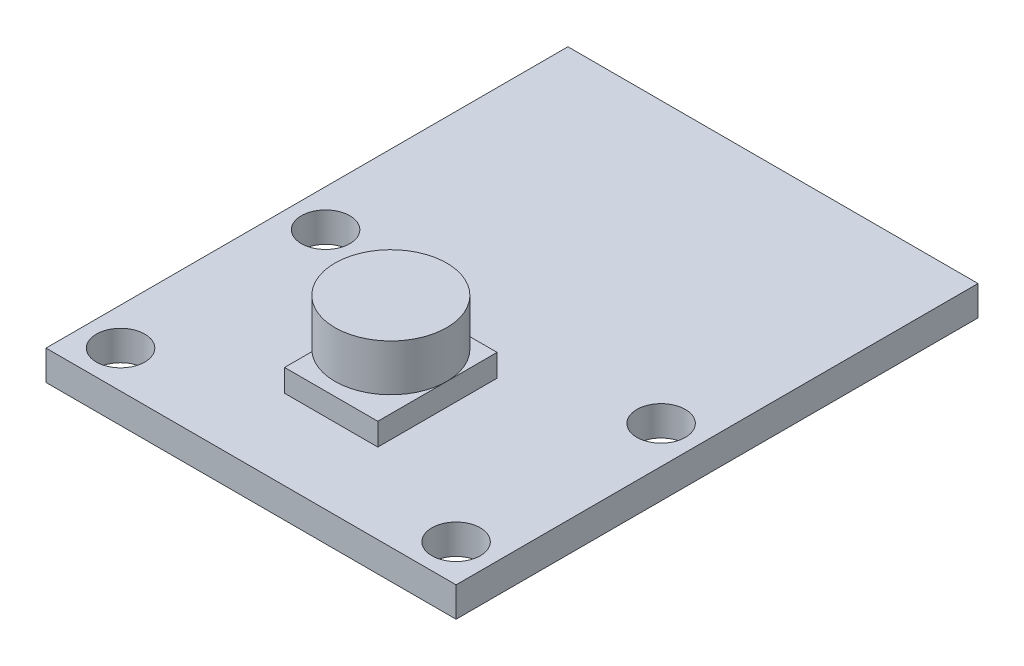
ISO-10303-21;
HEADER;
FILE_DESCRIPTION(('STEP AP214'),'2;1');
FILE_NAME('part.step','',(''),(''),'','','');
FILE_SCHEMA(('AUTOMOTIVE_DESIGN { 1 0 10303 214 1 1 1 1 }'));
ENDSEC;
DATA;
#1=APPLICATION_CONTEXT('core data for automotive mechanical design processes');
#2=APPLICATION_PROTOCOL_DEFINITION('international standard','automotive_design',2000,#1);
#3=PRODUCT_CONTEXT('',#1,'mechanical');
#4=PRODUCT('Part','Part','',(#3));
#5=PRODUCT_RELATED_PRODUCT_CATEGORY('part','',(#4));
#6=PRODUCT_DEFINITION_FORMATION('','',#4);
#7=PRODUCT_DEFINITION_CONTEXT('part definition',#1,'design');
#8=PRODUCT_DEFINITION('design','',#6,#7);
#9=PRODUCT_DEFINITION_SHAPE('','',#8);
#10=(LENGTH_UNIT() NAMED_UNIT(*) SI_UNIT(.MILLI.,.METRE.));
#11=(NAMED_UNIT(*) PLANE_ANGLE_UNIT() SI_UNIT($,.RADIAN.));
#12=(NAMED_UNIT(*) SI_UNIT($,.STERADIAN.) SOLID_ANGLE_UNIT());
#13=UNCERTAINTY_MEASURE_WITH_UNIT(LENGTH_MEASURE(1.E-05),#10,'distance_accuracy_value','');
#14=(GEOMETRIC_REPRESENTATION_CONTEXT(3) GLOBAL_UNCERTAINTY_ASSIGNED_CONTEXT((#13)) GLOBAL_UNIT_ASSIGNED_CONTEXT((#10,
#11,#12)) REPRESENTATION_CONTEXT('',''));
#15=CARTESIAN_POINT('',(0.,0.,0.));
#16=DIRECTION('',(0.,0.,1.));
#17=DIRECTION('',(1.,0.,0.));
#18=AXIS2_PLACEMENT_3D('',#15,#16,#17);
#19=CARTESIAN_POINT('',(0.,5.8,0.));
#20=DIRECTION('',(0.,-1.,0.));
#21=DIRECTION('',(0.,0.,-1.));
#22=AXIS2_PLACEMENT_3D('',#19,#20,#21);
#23=CYLINDRICAL_SURFACE('',#22,3.);
#24=CARTESIAN_POINT('',(0.,5.8,0.));
#25=DIRECTION('',(0.,1.,0.));
#26=DIRECTION('',(0.,0.,1.));
#27=AXIS2_PLACEMENT_3D('',#24,#25,#26);
#28=CIRCLE('',#27,3.);
#29=CARTESIAN_POINT('',(0.,5.8,3.));
#30=VERTEX_POINT('',#29);
#31=EDGE_CURVE('E11',#30,#30,#28,.T.);
#32=ORIENTED_EDGE('',*,*,#31,.F.);
#33=EDGE_LOOP('',(#32));
#34=FACE_BOUND('',#33,.T.);
#35=CARTESIAN_POINT('',(0.,3.3,0.));
#36=DIRECTION('',(0.,1.,0.));
#37=DIRECTION('',(0.,0.,1.));
#38=AXIS2_PLACEMENT_3D('',#35,#36,#37);
#39=CIRCLE('',#38,3.);
#40=CARTESIAN_POINT('',(0.,3.3,3.));
#41=VERTEX_POINT('',#40);
#42=EDGE_CURVE('E44',#41,#41,#39,.T.);
#43=ORIENTED_EDGE('',*,*,#42,.T.);
#44=EDGE_LOOP('',(#43));
#45=FACE_BOUND('',#44,.T.);
#46=ADVANCED_FACE('F41',(#34,#45),#23,.T.);
#47=CARTESIAN_POINT('',(0.,5.8,0.));
#48=DIRECTION('',(0.,1.,0.));
#49=DIRECTION('',(0.,0.,1.));
#50=AXIS2_PLACEMENT_3D('',#47,#48,#49);
#51=PLANE('',#50);
#52=ORIENTED_EDGE('',*,*,#31,.T.);
#53=EDGE_LOOP('',(#52));
#54=FACE_BOUND('',#53,.T.);
#55=ADVANCED_FACE('F56',(#54),#51,.T.);
#56=CARTESIAN_POINT('',(0.,3.3,0.));
#57=DIRECTION('',(0.,1.,0.));
#58=DIRECTION('',(0.,0.,1.));
#59=AXIS2_PLACEMENT_3D('',#56,#57,#58);
#60=PLANE('',#59);
#61=ORIENTED_EDGE('',*,*,#42,.F.);
#62=EDGE_LOOP('',(#61));
#63=FACE_BOUND('',#62,.T.);
#64=ADVANCED_FACE('F54',(#63),#60,.F.);
#65=CLOSED_SHELL('',(#46,#55,#64));
#66=MANIFOLD_SOLID_BREP('B2',#65);
#67=CARTESIAN_POINT('',(0.,1.6,0.));
#68=DIRECTION('',(0.,1.,0.));
#69=DIRECTION('',(0.,0.,1.));
#70=AXIS2_PLACEMENT_3D('',#67,#68,#69);
#71=PLANE('',#70);
#72=CARTESIAN_POINT('',(9.,1.6,5.5));
#73=DIRECTION('',(0.,1.,0.));
#74=DIRECTION('',(0.,0.,1.));
#75=AXIS2_PLACEMENT_3D('',#72,#73,#74);
#76=CIRCLE('',#75,1.3);
#77=CARTESIAN_POINT('',(9.,1.6,6.8));
#78=VERTEX_POINT('',#77);
#79=EDGE_CURVE('E191',#78,#78,#76,.T.);
#80=ORIENTED_EDGE('',*,*,#79,.F.);
#81=EDGE_LOOP('',(#80));
#82=FACE_BOUND('',#81,.T.);
#83=CARTESIAN_POINT('',(-9.,1.6,-5.5));
#84=DIRECTION('',(0.,1.,0.));
#85=DIRECTION('',(0.,0.,1.));
#86=AXIS2_PLACEMENT_3D('',#83,#84,#85);
#87=CIRCLE('',#86,1.3);
#88=CARTESIAN_POINT('',(-9.,1.6,-4.2));
#89=VERTEX_POINT('',#88);
#90=EDGE_CURVE('E203',#89,#89,#87,.T.);
#91=ORIENTED_EDGE('',*,*,#90,.F.);
#92=EDGE_LOOP('',(#91));
#93=FACE_BOUND('',#92,.T.);
#94=DIRECTION('',(0.,0.,1.));
#95=VECTOR('',#94,1.);
#96=CARTESIAN_POINT('',(-11.,1.6,-20.5));
#97=LINE('',#96,#95);
#98=CARTESIAN_POINT('',(-11.,1.6,-20.5));
#99=VERTEX_POINT('',#98);
#100=CARTESIAN_POINT('',(-11.,1.6,7.5));
#101=VERTEX_POINT('',#100);
#102=EDGE_CURVE('E209',#99,#101,#97,.T.);
#103=ORIENTED_EDGE('',*,*,#102,.T.);
#104=DIRECTION('',(1.,0.,0.));
#105=VECTOR('',#104,1.);
#106=CARTESIAN_POINT('',(-11.,1.6,7.5));
#107=LINE('',#106,#105);
#108=CARTESIAN_POINT('',(11.,1.6,7.5));
#109=VERTEX_POINT('',#108);
#110=EDGE_CURVE('E133',#101,#109,#107,.T.);
#111=ORIENTED_EDGE('',*,*,#110,.T.);
#112=DIRECTION('',(0.,0.,-1.));
#113=VECTOR('',#112,1.);
#114=CARTESIAN_POINT('',(11.,1.6,-20.5));
#115=LINE('',#114,#113);
#116=CARTESIAN_POINT('',(11.,1.6,-20.5));
#117=VERTEX_POINT('',#116);
#118=EDGE_CURVE('E212',#109,#117,#115,.T.);
#119=ORIENTED_EDGE('',*,*,#118,.T.);
#120=DIRECTION('',(-1.,0.,0.));
#121=VECTOR('',#120,1.);
#122=CARTESIAN_POINT('',(-11.,1.6,-20.5));
#123=LINE('',#122,#121);
#124=EDGE_CURVE('E105',#117,#99,#123,.T.);
#125=ORIENTED_EDGE('',*,*,#124,.T.);
#126=EDGE_LOOP('',(#103,#111,#119,#125));
#127=FACE_BOUND('',#126,.T.);
#128=CARTESIAN_POINT('',(9.,1.6,-5.5));
#129=DIRECTION('',(0.,1.,0.));
#130=DIRECTION('',(0.,0.,1.));
#131=AXIS2_PLACEMENT_3D('',#128,#129,#130);
#132=CIRCLE('',#131,1.3);
#133=CARTESIAN_POINT('',(9.,1.6,-4.2));
#134=VERTEX_POINT('',#133);
#135=EDGE_CURVE('E197',#134,#134,#132,.T.);
#136=ORIENTED_EDGE('',*,*,#135,.F.);
#137=EDGE_LOOP('',(#136));
#138=FACE_BOUND('',#137,.T.);
#139=CARTESIAN_POINT('',(-9.,1.6,5.5));
#140=DIRECTION('',(0.,1.,0.));
#141=DIRECTION('',(0.,0.,1.));
#142=AXIS2_PLACEMENT_3D('',#139,#140,#141);
#143=CIRCLE('',#142,1.3);
#144=CARTESIAN_POINT('',(-9.,1.6,6.8));
#145=VERTEX_POINT('',#144);
#146=EDGE_CURVE('E183',#145,#145,#143,.T.);
#147=ORIENTED_EDGE('',*,*,#146,.F.);
#148=EDGE_LOOP('',(#147));
#149=FACE_BOUND('',#148,.T.);
#150=DIRECTION('',(1.,0.,0.));
#151=VECTOR('',#150,1.);
#152=CARTESIAN_POINT('',(-2.5,1.6,3.2));
#153=LINE('',#152,#151);
#154=CARTESIAN_POINT('',(-2.5,1.6,3.2));
#155=VERTEX_POINT('',#154);
#156=CARTESIAN_POINT('',(2.5,1.6,3.2));
#157=VERTEX_POINT('',#156);
#158=EDGE_CURVE('E379',#155,#157,#153,.T.);
#159=ORIENTED_EDGE('',*,*,#158,.F.);
#160=DIRECTION('',(0.,0.,1.));
#161=VECTOR('',#160,1.);
#162=CARTESIAN_POINT('',(-2.5,1.6,-3.2));
#163=LINE('',#162,#161);
#164=CARTESIAN_POINT('',(-2.5,1.6,-3.2));
#165=VERTEX_POINT('',#164);
#166=EDGE_CURVE('E178',#165,#155,#163,.T.);
#167=ORIENTED_EDGE('',*,*,#166,.F.);
#168=DIRECTION('',(-1.,0.,0.));
#169=VECTOR('',#168,1.);
#170=CARTESIAN_POINT('',(-2.5,1.6,-3.2));
#171=LINE('',#170,#169);
#172=CARTESIAN_POINT('',(2.5,1.6,-3.2));
#173=VERTEX_POINT('',#172);
#174=EDGE_CURVE('E174',#173,#165,#171,.T.);
#175=ORIENTED_EDGE('',*,*,#174,.F.);
#176=DIRECTION('',(0.,0.,-1.));
#177=VECTOR('',#176,1.);
#178=CARTESIAN_POINT('',(2.5,1.6,-3.2));
#179=LINE('',#178,#177);
#180=EDGE_CURVE('E376',#157,#173,#179,.T.);
#181=ORIENTED_EDGE('',*,*,#180,.F.);
#182=EDGE_LOOP('',(#159,#167,#175,#181));
#183=FACE_BOUND('',#182,.T.);
#184=ADVANCED_FACE('F81',(#82,#93,#127,#138,#149,#183),#71,.T.);
#185=CARTESIAN_POINT('',(0.,0.,0.));
#186=DIRECTION('',(0.,1.,0.));
#187=DIRECTION('',(0.,0.,1.));
#188=AXIS2_PLACEMENT_3D('',#185,#186,#187);
#189=PLANE('',#188);
#190=DIRECTION('',(0.,0.,1.));
#191=VECTOR('',#190,1.);
#192=CARTESIAN_POINT('',(-11.,0.,-20.5));
#193=LINE('',#192,#191);
#194=CARTESIAN_POINT('',(-11.,0.,-20.5));
#195=VERTEX_POINT('',#194);
#196=CARTESIAN_POINT('',(-11.,0.,7.5));
#197=VERTEX_POINT('',#196);
#198=EDGE_CURVE('E206',#195,#197,#193,.T.);
#199=ORIENTED_EDGE('',*,*,#198,.F.);
#200=DIRECTION('',(-1.,0.,0.));
#201=VECTOR('',#200,1.);
#202=CARTESIAN_POINT('',(-11.,0.,-20.5));
#203=LINE('',#202,#201);
#204=CARTESIAN_POINT('',(11.,0.,-20.5));
#205=VERTEX_POINT('',#204);
#206=EDGE_CURVE('E126',#205,#195,#203,.T.);
#207=ORIENTED_EDGE('',*,*,#206,.F.);
#208=DIRECTION('',(0.,0.,-1.));
#209=VECTOR('',#208,1.);
#210=CARTESIAN_POINT('',(11.,0.,-20.5));
#211=LINE('',#210,#209);
#212=CARTESIAN_POINT('',(11.,0.,7.5));
#213=VERTEX_POINT('',#212);
#214=EDGE_CURVE('E220',#213,#205,#211,.T.);
#215=ORIENTED_EDGE('',*,*,#214,.F.);
#216=DIRECTION('',(1.,0.,0.));
#217=VECTOR('',#216,1.);
#218=CARTESIAN_POINT('',(-11.,0.,7.5));
#219=LINE('',#218,#217);
#220=EDGE_CURVE('E218',#197,#213,#219,.T.);
#221=ORIENTED_EDGE('',*,*,#220,.F.);
#222=EDGE_LOOP('',(#199,#207,#215,#221));
#223=FACE_BOUND('',#222,.T.);
#224=CARTESIAN_POINT('',(-9.,0.,-5.5));
#225=DIRECTION('',(0.,1.,0.));
#226=DIRECTION('',(0.,0.,1.));
#227=AXIS2_PLACEMENT_3D('',#224,#225,#226);
#228=CIRCLE('',#227,1.3);
#229=CARTESIAN_POINT('',(-9.,0.,-4.2));
#230=VERTEX_POINT('',#229);
#231=EDGE_CURVE('E200',#230,#230,#228,.T.);
#232=ORIENTED_EDGE('',*,*,#231,.T.);
#233=EDGE_LOOP('',(#232));
#234=FACE_BOUND('',#233,.T.);
#235=CARTESIAN_POINT('',(9.,0.,-5.5));
#236=DIRECTION('',(0.,1.,0.));
#237=DIRECTION('',(0.,0.,1.));
#238=AXIS2_PLACEMENT_3D('',#235,#236,#237);
#239=CIRCLE('',#238,1.3);
#240=CARTESIAN_POINT('',(9.,0.,-4.2));
#241=VERTEX_POINT('',#240);
#242=EDGE_CURVE('E194',#241,#241,#239,.T.);
#243=ORIENTED_EDGE('',*,*,#242,.T.);
#244=EDGE_LOOP('',(#243));
#245=FACE_BOUND('',#244,.T.);
#246=CARTESIAN_POINT('',(9.,0.,5.5));
#247=DIRECTION('',(0.,1.,0.));
#248=DIRECTION('',(0.,0.,1.));
#249=AXIS2_PLACEMENT_3D('',#246,#247,#248);
#250=CIRCLE('',#249,1.3);
#251=CARTESIAN_POINT('',(9.,0.,6.8));
#252=VERTEX_POINT('',#251);
#253=EDGE_CURVE('E189',#252,#252,#250,.T.);
#254=ORIENTED_EDGE('',*,*,#253,.T.);
#255=EDGE_LOOP('',(#254));
#256=FACE_BOUND('',#255,.T.);
#257=CARTESIAN_POINT('',(-9.,0.,5.5));
#258=DIRECTION('',(0.,1.,0.));
#259=DIRECTION('',(0.,0.,1.));
#260=AXIS2_PLACEMENT_3D('',#257,#258,#259);
#261=CIRCLE('',#260,1.3);
#262=CARTESIAN_POINT('',(-9.,0.,6.8));
#263=VERTEX_POINT('',#262);
#264=EDGE_CURVE('E180',#263,#263,#261,.T.);
#265=ORIENTED_EDGE('',*,*,#264,.T.);
#266=EDGE_LOOP('',(#265));
#267=FACE_BOUND('',#266,.T.);
#268=ADVANCED_FACE('F233',(#223,#234,#245,#256,#267),#189,.F.);
#269=CARTESIAN_POINT('',(-11.,1.6,-20.5));
#270=DIRECTION('',(1.,0.,0.));
#271=DIRECTION('',(0.,0.,-1.));
#272=AXIS2_PLACEMENT_3D('',#269,#270,#271);
#273=PLANE('',#272);
#274=ORIENTED_EDGE('',*,*,#198,.T.);
#275=DIRECTION('',(0.,-1.,0.));
#276=VECTOR('',#275,1.);
#277=CARTESIAN_POINT('',(-11.,1.6,7.5));
#278=LINE('',#277,#276);
#279=EDGE_CURVE('E39',#101,#197,#278,.T.);
#280=ORIENTED_EDGE('',*,*,#279,.F.);
#281=ORIENTED_EDGE('',*,*,#102,.F.);
#282=DIRECTION('',(0.,-1.,0.));
#283=VECTOR('',#282,1.);
#284=CARTESIAN_POINT('',(-11.,1.6,-20.5));
#285=LINE('',#284,#283);
#286=EDGE_CURVE('E215',#99,#195,#285,.T.);
#287=ORIENTED_EDGE('',*,*,#286,.T.);
#288=EDGE_LOOP('',(#274,#280,#281,#287));
#289=FACE_BOUND('',#288,.T.);
#290=ADVANCED_FACE('F83',(#289),#273,.F.);
#291=CARTESIAN_POINT('',(-11.,1.6,7.5));
#292=DIRECTION('',(0.,0.,-1.));
#293=DIRECTION('',(-1.,0.,0.));
#294=AXIS2_PLACEMENT_3D('',#291,#292,#293);
#295=PLANE('',#294);
#296=ORIENTED_EDGE('',*,*,#220,.T.);
#297=DIRECTION('',(0.,-1.,0.));
#298=VECTOR('',#297,1.);
#299=CARTESIAN_POINT('',(11.,1.6,7.5));
#300=LINE('',#299,#298);
#301=EDGE_CURVE('E89',#109,#213,#300,.T.);
#302=ORIENTED_EDGE('',*,*,#301,.F.);
#303=ORIENTED_EDGE('',*,*,#110,.F.);
#304=ORIENTED_EDGE('',*,*,#279,.T.);
#305=EDGE_LOOP('',(#296,#302,#303,#304));
#306=FACE_BOUND('',#305,.T.);
#307=ADVANCED_FACE('F249',(#306),#295,.F.);
#308=CARTESIAN_POINT('',(11.,1.6,-20.5));
#309=DIRECTION('',(-1.,0.,0.));
#310=DIRECTION('',(0.,0.,1.));
#311=AXIS2_PLACEMENT_3D('',#308,#309,#310);
#312=PLANE('',#311);
#313=ORIENTED_EDGE('',*,*,#214,.T.);
#314=DIRECTION('',(0.,-1.,0.));
#315=VECTOR('',#314,1.);
#316=CARTESIAN_POINT('',(11.,1.6,-20.5));
#317=LINE('',#316,#315);
#318=EDGE_CURVE('E224',#117,#205,#317,.T.);
#319=ORIENTED_EDGE('',*,*,#318,.F.);
#320=ORIENTED_EDGE('',*,*,#118,.F.);
#321=ORIENTED_EDGE('',*,*,#301,.T.);
#322=EDGE_LOOP('',(#313,#319,#320,#321));
#323=FACE_BOUND('',#322,.T.);
#324=ADVANCED_FACE('F229',(#323),#312,.F.);
#325=CARTESIAN_POINT('',(-11.,1.6,-20.5));
#326=DIRECTION('',(0.,0.,1.));
#327=DIRECTION('',(1.,0.,0.));
#328=AXIS2_PLACEMENT_3D('',#325,#326,#327);
#329=PLANE('',#328);
#330=ORIENTED_EDGE('',*,*,#206,.T.);
#331=ORIENTED_EDGE('',*,*,#286,.F.);
#332=ORIENTED_EDGE('',*,*,#124,.F.);
#333=ORIENTED_EDGE('',*,*,#318,.T.);
#334=EDGE_LOOP('',(#330,#331,#332,#333));
#335=FACE_BOUND('',#334,.T.);
#336=ADVANCED_FACE('F238',(#335),#329,.F.);
#337=CARTESIAN_POINT('',(-9.,1.6,-5.5));
#338=DIRECTION('',(0.,-1.,0.));
#339=DIRECTION('',(0.,0.,-1.));
#340=AXIS2_PLACEMENT_3D('',#337,#338,#339);
#341=CYLINDRICAL_SURFACE('',#340,1.3);
#342=ORIENTED_EDGE('',*,*,#90,.T.);
#343=EDGE_LOOP('',(#342));
#344=FACE_BOUND('',#343,.T.);
#345=ORIENTED_EDGE('',*,*,#231,.F.);
#346=EDGE_LOOP('',(#345));
#347=FACE_BOUND('',#346,.T.);
#348=ADVANCED_FACE('F240',(#344,#347),#341,.F.);
#349=CARTESIAN_POINT('',(9.,1.6,-5.5));
#350=DIRECTION('',(0.,-1.,0.));
#351=DIRECTION('',(0.,0.,-1.));
#352=AXIS2_PLACEMENT_3D('',#349,#350,#351);
#353=CYLINDRICAL_SURFACE('',#352,1.3);
#354=ORIENTED_EDGE('',*,*,#135,.T.);
#355=EDGE_LOOP('',(#354));
#356=FACE_BOUND('',#355,.T.);
#357=ORIENTED_EDGE('',*,*,#242,.F.);
#358=EDGE_LOOP('',(#357));
#359=FACE_BOUND('',#358,.T.);
#360=ADVANCED_FACE('F246',(#356,#359),#353,.F.);
#361=CARTESIAN_POINT('',(9.,1.6,5.5));
#362=DIRECTION('',(0.,-1.,0.));
#363=DIRECTION('',(0.,0.,-1.));
#364=AXIS2_PLACEMENT_3D('',#361,#362,#363);
#365=CYLINDRICAL_SURFACE('',#364,1.3);
#366=ORIENTED_EDGE('',*,*,#79,.T.);
#367=EDGE_LOOP('',(#366));
#368=FACE_BOUND('',#367,.T.);
#369=ORIENTED_EDGE('',*,*,#253,.F.);
#370=EDGE_LOOP('',(#369));
#371=FACE_BOUND('',#370,.T.);
#372=ADVANCED_FACE('F263',(#368,#371),#365,.F.);
#373=CARTESIAN_POINT('',(-9.,1.6,5.5));
#374=DIRECTION('',(0.,-1.,0.));
#375=DIRECTION('',(0.,0.,-1.));
#376=AXIS2_PLACEMENT_3D('',#373,#374,#375);
#377=CYLINDRICAL_SURFACE('',#376,1.3);
#378=ORIENTED_EDGE('',*,*,#146,.T.);
#379=EDGE_LOOP('',(#378));
#380=FACE_BOUND('',#379,.T.);
#381=ORIENTED_EDGE('',*,*,#264,.F.);
#382=EDGE_LOOP('',(#381));
#383=FACE_BOUND('',#382,.T.);
#384=ADVANCED_FACE('F267',(#380,#383),#377,.F.);
#385=CARTESIAN_POINT('',(-2.5,2.8,-3.2));
#386=DIRECTION('',(1.,0.,0.));
#387=DIRECTION('',(0.,0.,-1.));
#388=AXIS2_PLACEMENT_3D('',#385,#386,#387);
#389=PLANE('',#388);
#390=ORIENTED_EDGE('',*,*,#166,.T.);
#391=DIRECTION('',(0.,-1.,0.));
#392=VECTOR('',#391,1.);
#393=CARTESIAN_POINT('',(-2.5,2.8,3.2));
#394=LINE('',#393,#392);
#395=CARTESIAN_POINT('',(-2.5,2.8,3.2));
#396=VERTEX_POINT('',#395);
#397=EDGE_CURVE('E159',#396,#155,#394,.T.);
#398=ORIENTED_EDGE('',*,*,#397,.F.);
#399=DIRECTION('',(0.,0.,1.));
#400=VECTOR('',#399,1.);
#401=CARTESIAN_POINT('',(-2.5,2.8,-3.2));
#402=LINE('',#401,#400);
#403=CARTESIAN_POINT('',(-2.5,2.8,-3.2));
#404=VERTEX_POINT('',#403);
#405=EDGE_CURVE('E166',#404,#396,#402,.T.);
#406=ORIENTED_EDGE('',*,*,#405,.F.);
#407=DIRECTION('',(0.,-1.,0.));
#408=VECTOR('',#407,1.);
#409=CARTESIAN_POINT('',(-2.5,2.8,-3.2));
#410=LINE('',#409,#408);
#411=EDGE_CURVE('E373',#404,#165,#410,.T.);
#412=ORIENTED_EDGE('',*,*,#411,.T.);
#413=EDGE_LOOP('',(#390,#398,#406,#412));
#414=FACE_BOUND('',#413,.T.);
#415=ADVANCED_FACE('F176',(#414),#389,.F.);
#416=CARTESIAN_POINT('',(-2.5,2.8,3.2));
#417=DIRECTION('',(0.,0.,-1.));
#418=DIRECTION('',(-1.,0.,0.));
#419=AXIS2_PLACEMENT_3D('',#416,#417,#418);
#420=PLANE('',#419);
#421=ORIENTED_EDGE('',*,*,#158,.T.);
#422=DIRECTION('',(0.,-1.,0.));
#423=VECTOR('',#422,1.);
#424=CARTESIAN_POINT('',(2.5,2.8,3.2));
#425=LINE('',#424,#423);
#426=CARTESIAN_POINT('',(2.5,2.8,3.2));
#427=VERTEX_POINT('',#426);
#428=EDGE_CURVE('E162',#427,#157,#425,.T.);
#429=ORIENTED_EDGE('',*,*,#428,.F.);
#430=DIRECTION('',(1.,0.,0.));
#431=VECTOR('',#430,1.);
#432=CARTESIAN_POINT('',(-2.5,2.8,3.2));
#433=LINE('',#432,#431);
#434=EDGE_CURVE('E155',#396,#427,#433,.T.);
#435=ORIENTED_EDGE('',*,*,#434,.F.);
#436=ORIENTED_EDGE('',*,*,#397,.T.);
#437=EDGE_LOOP('',(#421,#429,#435,#436));
#438=FACE_BOUND('',#437,.T.);
#439=ADVANCED_FACE('F157',(#438),#420,.F.);
#440=CARTESIAN_POINT('',(2.5,2.8,-3.2));
#441=DIRECTION('',(-1.,0.,0.));
#442=DIRECTION('',(0.,0.,1.));
#443=AXIS2_PLACEMENT_3D('',#440,#441,#442);
#444=PLANE('',#443);
#445=ORIENTED_EDGE('',*,*,#180,.T.);
#446=DIRECTION('',(0.,-1.,0.));
#447=VECTOR('',#446,1.);
#448=CARTESIAN_POINT('',(2.5,2.8,-3.2));
#449=LINE('',#448,#447);
#450=CARTESIAN_POINT('',(2.5,2.8,-3.2));
#451=VERTEX_POINT('',#450);
#452=EDGE_CURVE('E96',#451,#173,#449,.T.);
#453=ORIENTED_EDGE('',*,*,#452,.F.);
#454=DIRECTION('',(0.,0.,-1.));
#455=VECTOR('',#454,1.);
#456=CARTESIAN_POINT('',(2.5,2.8,-3.2));
#457=LINE('',#456,#455);
#458=EDGE_CURVE('E165',#427,#451,#457,.T.);
#459=ORIENTED_EDGE('',*,*,#458,.F.);
#460=ORIENTED_EDGE('',*,*,#428,.T.);
#461=EDGE_LOOP('',(#445,#453,#459,#460));
#462=FACE_BOUND('',#461,.T.);
#463=ADVANCED_FACE('F276',(#462),#444,.F.);
#464=CARTESIAN_POINT('',(-2.5,2.8,-3.2));
#465=DIRECTION('',(0.,0.,1.));
#466=DIRECTION('',(1.,0.,0.));
#467=AXIS2_PLACEMENT_3D('',#464,#465,#466);
#468=PLANE('',#467);
#469=ORIENTED_EDGE('',*,*,#174,.T.);
#470=ORIENTED_EDGE('',*,*,#411,.F.);
#471=DIRECTION('',(-1.,0.,0.));
#472=VECTOR('',#471,1.);
#473=CARTESIAN_POINT('',(-2.5,2.8,-3.2));
#474=LINE('',#473,#472);
#475=EDGE_CURVE('E170',#451,#404,#474,.T.);
#476=ORIENTED_EDGE('',*,*,#475,.F.);
#477=ORIENTED_EDGE('',*,*,#452,.T.);
#478=EDGE_LOOP('',(#469,#470,#476,#477));
#479=FACE_BOUND('',#478,.T.);
#480=ADVANCED_FACE('F279',(#479),#468,.F.);
#481=CARTESIAN_POINT('',(0.,2.8,0.));
#482=DIRECTION('',(0.,1.,0.));
#483=DIRECTION('',(0.,0.,1.));
#484=AXIS2_PLACEMENT_3D('',#481,#482,#483);
#485=PLANE('',#484);
#486=ORIENTED_EDGE('',*,*,#405,.T.);
#487=ORIENTED_EDGE('',*,*,#434,.T.);
#488=ORIENTED_EDGE('',*,*,#458,.T.);
#489=ORIENTED_EDGE('',*,*,#475,.T.);
#490=EDGE_LOOP('',(#486,#487,#488,#489));
#491=FACE_BOUND('',#490,.T.);
#492=ADVANCED_FACE('F169',(#491),#485,.T.);
#493=CLOSED_SHELL('',(#184,#268,#290,#307,#324,#336,#348,#360,#372,#384,#415,#439,#463,#480,#492));
#494=MANIFOLD_SOLID_BREP('B6',#493);
#495=ADVANCED_BREP_SHAPE_REPRESENTATION('',(#18,#66,#494),#14);
#496=SHAPE_DEFINITION_REPRESENTATION(#9,#495);
ENDSEC;
END-ISO-10303-21;
